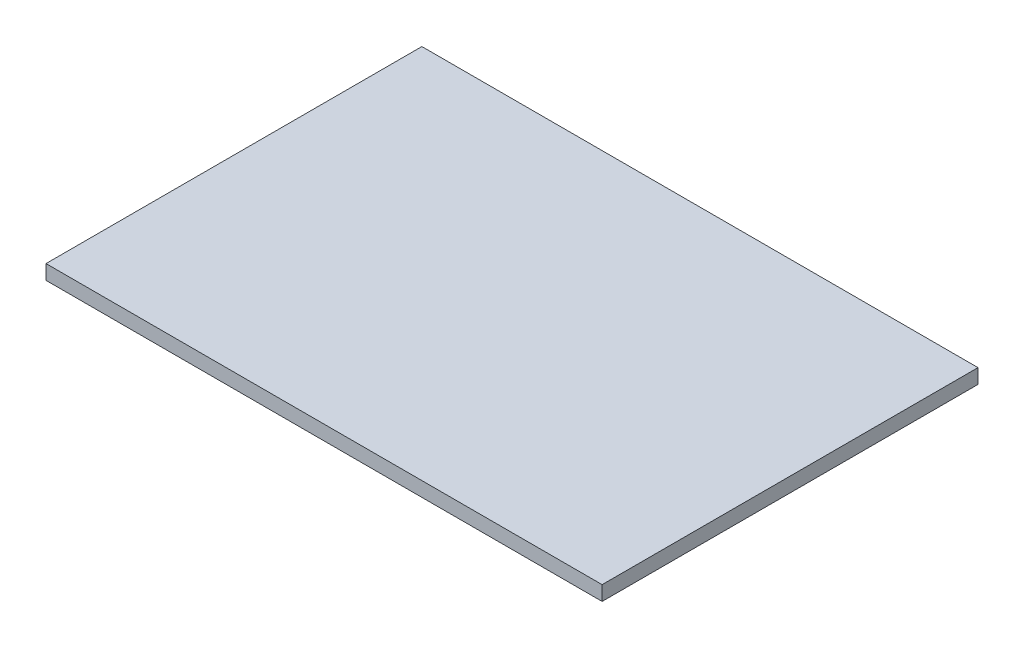
ISO-10303-21;
HEADER;
FILE_DESCRIPTION(('STEP AP214'),'2;1');
FILE_NAME('part.step','',(''),(''),'','','');
FILE_SCHEMA(('AUTOMOTIVE_DESIGN { 1 0 10303 214 1 1 1 1 }'));
ENDSEC;
DATA;
#1=APPLICATION_CONTEXT('core data for automotive mechanical design processes');
#2=APPLICATION_PROTOCOL_DEFINITION('international standard','automotive_design',2000,#1);
#3=PRODUCT_CONTEXT('',#1,'mechanical');
#4=PRODUCT('Part','Part','',(#3));
#5=PRODUCT_RELATED_PRODUCT_CATEGORY('part','',(#4));
#6=PRODUCT_DEFINITION_FORMATION('','',#4);
#7=PRODUCT_DEFINITION_CONTEXT('part definition',#1,'design');
#8=PRODUCT_DEFINITION('design','',#6,#7);
#9=PRODUCT_DEFINITION_SHAPE('','',#8);
#10=(LENGTH_UNIT() NAMED_UNIT(*) SI_UNIT(.MILLI.,.METRE.));
#11=(NAMED_UNIT(*) PLANE_ANGLE_UNIT() SI_UNIT($,.RADIAN.));
#12=(NAMED_UNIT(*) SI_UNIT($,.STERADIAN.) SOLID_ANGLE_UNIT());
#13=UNCERTAINTY_MEASURE_WITH_UNIT(LENGTH_MEASURE(1.E-05),#10,'distance_accuracy_value','');
#14=(GEOMETRIC_REPRESENTATION_CONTEXT(3) GLOBAL_UNCERTAINTY_ASSIGNED_CONTEXT((#13)) GLOBAL_UNIT_ASSIGNED_CONTEXT((#10,
#11,#12)) REPRESENTATION_CONTEXT('',''));
#15=CARTESIAN_POINT('',(0.,0.,0.));
#16=DIRECTION('',(0.,0.,1.));
#17=DIRECTION('',(1.,0.,0.));
#18=AXIS2_PLACEMENT_3D('',#15,#16,#17);
#19=CARTESIAN_POINT('',(45.05,1.18,-30.45));
#20=DIRECTION('',(-1.,0.,0.));
#21=DIRECTION('',(0.,0.,1.));
#22=AXIS2_PLACEMENT_3D('',#19,#20,#21);
#23=PLANE('',#22);
#24=DIRECTION('',(0.,0.,-1.));
#25=VECTOR('',#24,1.);
#26=CARTESIAN_POINT('',(45.05,-1.18,-30.45));
#27=LINE('',#26,#25);
#28=CARTESIAN_POINT('',(45.05,-1.18,30.45));
#29=VERTEX_POINT('',#28);
#30=CARTESIAN_POINT('',(45.05,-1.18,-30.45));
#31=VERTEX_POINT('',#30);
#32=EDGE_CURVE('E107',#29,#31,#27,.T.);
#33=ORIENTED_EDGE('',*,*,#32,.T.);
#34=DIRECTION('',(0.,-1.,0.));
#35=VECTOR('',#34,1.);
#36=CARTESIAN_POINT('',(45.05,1.18,-30.45));
#37=LINE('',#36,#35);
#38=CARTESIAN_POINT('',(45.05,1.18,-30.45));
#39=VERTEX_POINT('',#38);
#40=EDGE_CURVE('E11',#39,#31,#37,.T.);
#41=ORIENTED_EDGE('',*,*,#40,.F.);
#42=DIRECTION('',(0.,0.,-1.));
#43=VECTOR('',#42,1.);
#44=CARTESIAN_POINT('',(45.05,1.18,-30.45));
#45=LINE('',#44,#43);
#46=CARTESIAN_POINT('',(45.05,1.18,30.45));
#47=VERTEX_POINT('',#46);
#48=EDGE_CURVE('E91',#47,#39,#45,.T.);
#49=ORIENTED_EDGE('',*,*,#48,.F.);
#50=DIRECTION('',(0.,-1.,0.));
#51=VECTOR('',#50,1.);
#52=CARTESIAN_POINT('',(45.05,1.18,30.45));
#53=LINE('',#52,#51);
#54=EDGE_CURVE('E103',#47,#29,#53,.T.);
#55=ORIENTED_EDGE('',*,*,#54,.T.);
#56=EDGE_LOOP('',(#33,#41,#49,#55));
#57=FACE_BOUND('',#56,.T.);
#58=ADVANCED_FACE('F39',(#57),#23,.F.);
#59=CARTESIAN_POINT('',(-45.05,1.18,-30.45));
#60=DIRECTION('',(0.,0.,1.));
#61=DIRECTION('',(1.,0.,0.));
#62=AXIS2_PLACEMENT_3D('',#59,#60,#61);
#63=PLANE('',#62);
#64=DIRECTION('',(-1.,0.,0.));
#65=VECTOR('',#64,1.);
#66=CARTESIAN_POINT('',(-45.05,-1.18,-30.45));
#67=LINE('',#66,#65);
#68=CARTESIAN_POINT('',(-45.05,-1.18,-30.45));
#69=VERTEX_POINT('',#68);
#70=EDGE_CURVE('E96',#31,#69,#67,.T.);
#71=ORIENTED_EDGE('',*,*,#70,.T.);
#72=DIRECTION('',(0.,-1.,0.));
#73=VECTOR('',#72,1.);
#74=CARTESIAN_POINT('',(-45.05,1.18,-30.45));
#75=LINE('',#74,#73);
#76=CARTESIAN_POINT('',(-45.05,1.18,-30.45));
#77=VERTEX_POINT('',#76);
#78=EDGE_CURVE('E48',#77,#69,#75,.T.);
#79=ORIENTED_EDGE('',*,*,#78,.F.);
#80=DIRECTION('',(-1.,0.,0.));
#81=VECTOR('',#80,1.);
#82=CARTESIAN_POINT('',(-45.05,1.18,-30.45));
#83=LINE('',#82,#81);
#84=EDGE_CURVE('E86',#39,#77,#83,.T.);
#85=ORIENTED_EDGE('',*,*,#84,.F.);
#86=ORIENTED_EDGE('',*,*,#40,.T.);
#87=EDGE_LOOP('',(#71,#79,#85,#86));
#88=FACE_BOUND('',#87,.T.);
#89=ADVANCED_FACE('F95',(#88),#63,.F.);
#90=CARTESIAN_POINT('',(-45.05,1.18,-30.45));
#91=DIRECTION('',(1.,0.,0.));
#92=DIRECTION('',(0.,0.,-1.));
#93=AXIS2_PLACEMENT_3D('',#90,#91,#92);
#94=PLANE('',#93);
#95=DIRECTION('',(0.,0.,1.));
#96=VECTOR('',#95,1.);
#97=CARTESIAN_POINT('',(-45.05,-1.18,-30.45));
#98=LINE('',#97,#96);
#99=CARTESIAN_POINT('',(-45.05,-1.18,30.45));
#100=VERTEX_POINT('',#99);
#101=EDGE_CURVE('E73',#69,#100,#98,.T.);
#102=ORIENTED_EDGE('',*,*,#101,.T.);
#103=DIRECTION('',(0.,-1.,0.));
#104=VECTOR('',#103,1.);
#105=CARTESIAN_POINT('',(-45.05,1.18,30.45));
#106=LINE('',#105,#104);
#107=CARTESIAN_POINT('',(-45.05,1.18,30.45));
#108=VERTEX_POINT('',#107);
#109=EDGE_CURVE('E98',#108,#100,#106,.T.);
#110=ORIENTED_EDGE('',*,*,#109,.F.);
#111=DIRECTION('',(0.,0.,1.));
#112=VECTOR('',#111,1.);
#113=CARTESIAN_POINT('',(-45.05,1.18,-30.45));
#114=LINE('',#113,#112);
#115=EDGE_CURVE('E89',#77,#108,#114,.T.);
#116=ORIENTED_EDGE('',*,*,#115,.F.);
#117=ORIENTED_EDGE('',*,*,#78,.T.);
#118=EDGE_LOOP('',(#102,#110,#116,#117));
#119=FACE_BOUND('',#118,.T.);
#120=ADVANCED_FACE('F99',(#119),#94,.F.);
#121=CARTESIAN_POINT('',(-45.05,1.18,30.45));
#122=DIRECTION('',(0.,0.,-1.));
#123=DIRECTION('',(-1.,0.,0.));
#124=AXIS2_PLACEMENT_3D('',#121,#122,#123);
#125=PLANE('',#124);
#126=DIRECTION('',(1.,0.,0.));
#127=VECTOR('',#126,1.);
#128=CARTESIAN_POINT('',(-45.05,-1.18,30.45));
#129=LINE('',#128,#127);
#130=EDGE_CURVE('E79',#100,#29,#129,.T.);
#131=ORIENTED_EDGE('',*,*,#130,.T.);
#132=ORIENTED_EDGE('',*,*,#54,.F.);
#133=DIRECTION('',(1.,0.,0.));
#134=VECTOR('',#133,1.);
#135=CARTESIAN_POINT('',(-45.05,1.18,30.45));
#136=LINE('',#135,#134);
#137=EDGE_CURVE('E56',#108,#47,#136,.T.);
#138=ORIENTED_EDGE('',*,*,#137,.F.);
#139=ORIENTED_EDGE('',*,*,#109,.T.);
#140=EDGE_LOOP('',(#131,#132,#138,#139));
#141=FACE_BOUND('',#140,.T.);
#142=ADVANCED_FACE('F120',(#141),#125,.F.);
#143=CARTESIAN_POINT('',(0.,1.18,0.));
#144=DIRECTION('',(0.,1.,0.));
#145=DIRECTION('',(0.,0.,1.));
#146=AXIS2_PLACEMENT_3D('',#143,#144,#145);
#147=PLANE('',#146);
#148=ORIENTED_EDGE('',*,*,#48,.T.);
#149=ORIENTED_EDGE('',*,*,#84,.T.);
#150=ORIENTED_EDGE('',*,*,#115,.T.);
#151=ORIENTED_EDGE('',*,*,#137,.T.);
#152=EDGE_LOOP('',(#148,#149,#150,#151));
#153=FACE_BOUND('',#152,.T.);
#154=ADVANCED_FACE('F87',(#153),#147,.T.);
#155=CARTESIAN_POINT('',(0.,-1.18,0.));
#156=DIRECTION('',(0.,1.,0.));
#157=DIRECTION('',(0.,0.,1.));
#158=AXIS2_PLACEMENT_3D('',#155,#156,#157);
#159=PLANE('',#158);
#160=ORIENTED_EDGE('',*,*,#32,.F.);
#161=ORIENTED_EDGE('',*,*,#130,.F.);
#162=ORIENTED_EDGE('',*,*,#101,.F.);
#163=ORIENTED_EDGE('',*,*,#70,.F.);
#164=EDGE_LOOP('',(#160,#161,#162,#163));
#165=FACE_BOUND('',#164,.T.);
#166=ADVANCED_FACE('F123',(#165),#159,.F.);
#167=CLOSED_SHELL('',(#58,#89,#120,#142,#154,#166));
#168=MANIFOLD_SOLID_BREP('B2',#167);
#169=ADVANCED_BREP_SHAPE_REPRESENTATION('',(#18,#168),#14);
#170=SHAPE_DEFINITION_REPRESENTATION(#9,#169);
ENDSEC;
END-ISO-10303-21;
